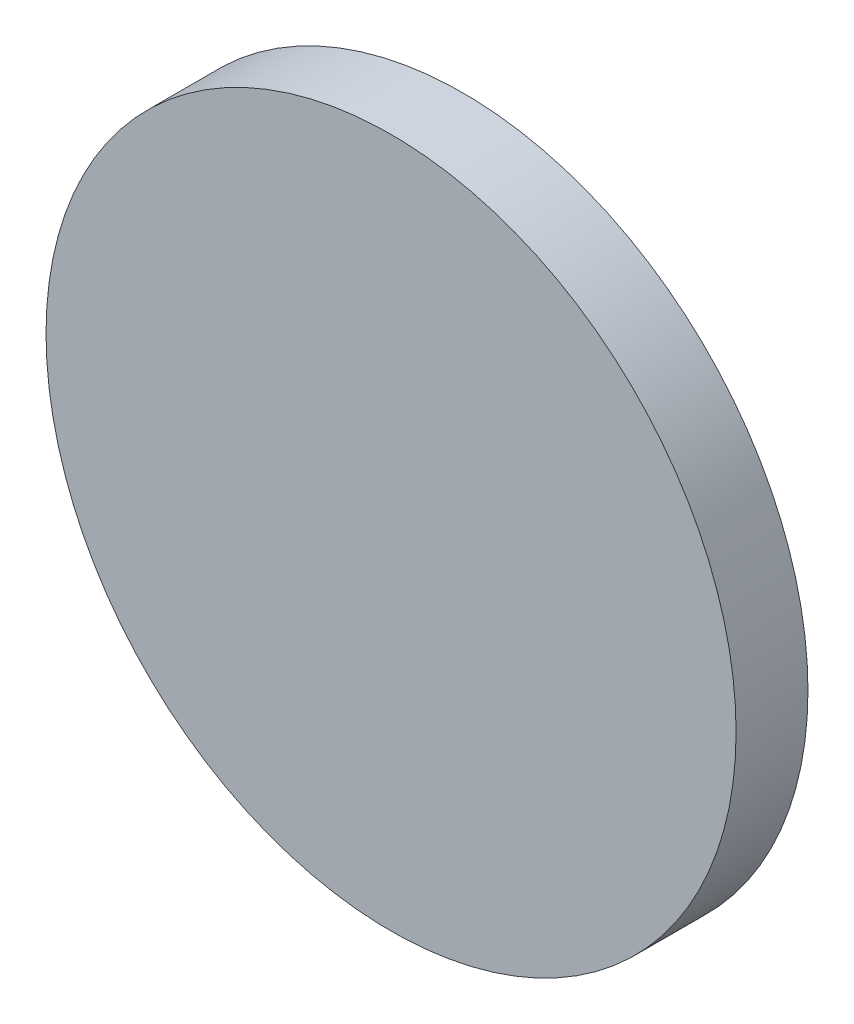
ISO-10303-21;
HEADER;
FILE_DESCRIPTION(('STEP AP214'),'2;1');
FILE_NAME('part.step','',(''),(''),'','','');
FILE_SCHEMA(('AUTOMOTIVE_DESIGN { 1 0 10303 214 1 1 1 1 }'));
ENDSEC;
DATA;
#1=APPLICATION_CONTEXT('core data for automotive mechanical design processes');
#2=APPLICATION_PROTOCOL_DEFINITION('international standard','automotive_design',2000,#1);
#3=PRODUCT_CONTEXT('',#1,'mechanical');
#4=PRODUCT('Part','Part','',(#3));
#5=PRODUCT_RELATED_PRODUCT_CATEGORY('part','',(#4));
#6=PRODUCT_DEFINITION_FORMATION('','',#4);
#7=PRODUCT_DEFINITION_CONTEXT('part definition',#1,'design');
#8=PRODUCT_DEFINITION('design','',#6,#7);
#9=PRODUCT_DEFINITION_SHAPE('','',#8);
#10=(LENGTH_UNIT() NAMED_UNIT(*) SI_UNIT(.MILLI.,.METRE.));
#11=(NAMED_UNIT(*) PLANE_ANGLE_UNIT() SI_UNIT($,.RADIAN.));
#12=(NAMED_UNIT(*) SI_UNIT($,.STERADIAN.) SOLID_ANGLE_UNIT());
#13=UNCERTAINTY_MEASURE_WITH_UNIT(LENGTH_MEASURE(1.E-05),#10,'distance_accuracy_value','');
#14=(GEOMETRIC_REPRESENTATION_CONTEXT(3) GLOBAL_UNCERTAINTY_ASSIGNED_CONTEXT((#13)) GLOBAL_UNIT_ASSIGNED_CONTEXT((#10,
#11,#12)) REPRESENTATION_CONTEXT('',''));
#15=CARTESIAN_POINT('',(0.,0.,0.));
#16=DIRECTION('',(0.,0.,1.));
#17=DIRECTION('',(1.,0.,0.));
#18=AXIS2_PLACEMENT_3D('',#15,#16,#17);
#19=CARTESIAN_POINT('',(0.,0.,7.9375));
#20=DIRECTION('',(0.,0.,-1.));
#21=DIRECTION('',(-1.,0.,0.));
#22=AXIS2_PLACEMENT_3D('',#19,#20,#21);
#23=CYLINDRICAL_SURFACE('',#22,76.2);
#24=CARTESIAN_POINT('',(0.,0.,7.9375));
#25=DIRECTION('',(0.,0.,1.));
#26=DIRECTION('',(1.,0.,0.));
#27=AXIS2_PLACEMENT_3D('',#24,#25,#26);
#28=CIRCLE('',#27,76.2);
#29=CARTESIAN_POINT('',(76.2,0.,7.9375));
#30=VERTEX_POINT('',#29);
#31=EDGE_CURVE('E11',#30,#30,#28,.T.);
#32=ORIENTED_EDGE('',*,*,#31,.F.);
#33=EDGE_LOOP('',(#32));
#34=FACE_BOUND('',#33,.T.);
#35=CARTESIAN_POINT('',(0.,0.,-7.9375));
#36=DIRECTION('',(0.,0.,1.));
#37=DIRECTION('',(1.,0.,0.));
#38=AXIS2_PLACEMENT_3D('',#35,#36,#37);
#39=CIRCLE('',#38,76.2);
#40=CARTESIAN_POINT('',(76.2,0.,-7.9375));
#41=VERTEX_POINT('',#40);
#42=EDGE_CURVE('E46',#41,#41,#39,.T.);
#43=ORIENTED_EDGE('',*,*,#42,.T.);
#44=EDGE_LOOP('',(#43));
#45=FACE_BOUND('',#44,.T.);
#46=ADVANCED_FACE('F39',(#34,#45),#23,.T.);
#47=CARTESIAN_POINT('',(0.,0.,7.9375));
#48=DIRECTION('',(0.,0.,1.));
#49=DIRECTION('',(1.,0.,0.));
#50=AXIS2_PLACEMENT_3D('',#47,#48,#49);
#51=PLANE('',#50);
#52=ORIENTED_EDGE('',*,*,#31,.T.);
#53=EDGE_LOOP('',(#52));
#54=FACE_BOUND('',#53,.T.);
#55=ADVANCED_FACE('F58',(#54),#51,.T.);
#56=CARTESIAN_POINT('',(0.,0.,-7.9375));
#57=DIRECTION('',(0.,0.,1.));
#58=DIRECTION('',(1.,0.,0.));
#59=AXIS2_PLACEMENT_3D('',#56,#57,#58);
#60=PLANE('',#59);
#61=ORIENTED_EDGE('',*,*,#42,.F.);
#62=EDGE_LOOP('',(#61));
#63=FACE_BOUND('',#62,.T.);
#64=ADVANCED_FACE('F56',(#63),#60,.F.);
#65=CLOSED_SHELL('',(#46,#55,#64));
#66=MANIFOLD_SOLID_BREP('B2',#65);
#67=ADVANCED_BREP_SHAPE_REPRESENTATION('',(#18,#66),#14);
#68=SHAPE_DEFINITION_REPRESENTATION(#9,#67);
ENDSEC;
END-ISO-10303-21;
